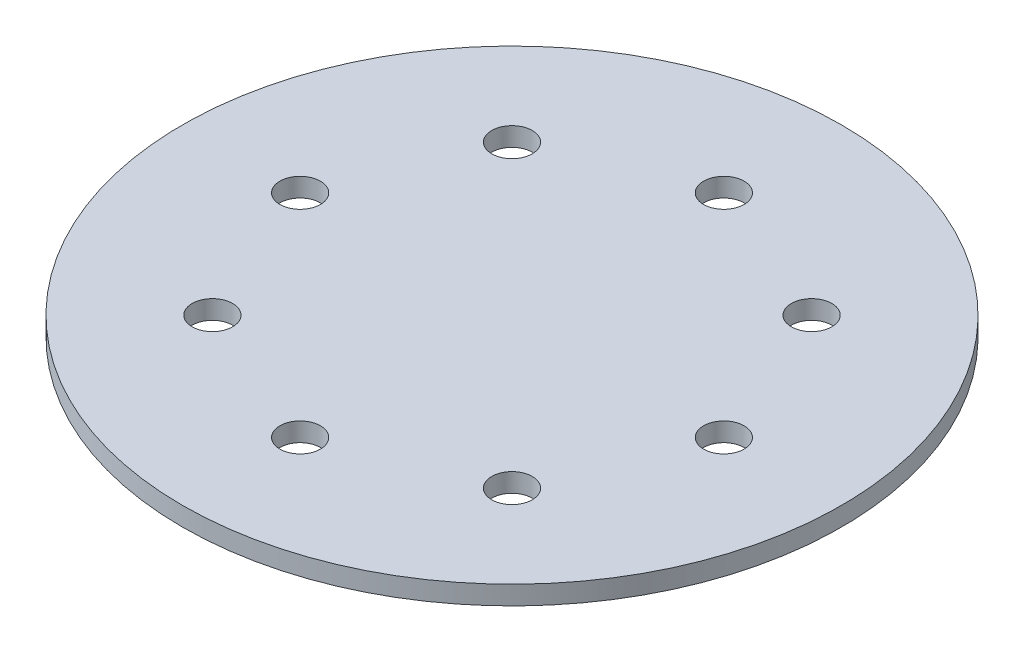
ISO-10303-21;
HEADER;
FILE_DESCRIPTION(('STEP AP214'),'2;1');
FILE_NAME('part.step','',(''),(''),'','','');
FILE_SCHEMA(('AUTOMOTIVE_DESIGN { 1 0 10303 214 1 1 1 1 }'));
ENDSEC;
DATA;
#1=APPLICATION_CONTEXT('core data for automotive mechanical design processes');
#2=APPLICATION_PROTOCOL_DEFINITION('international standard','automotive_design',2000,#1);
#3=PRODUCT_CONTEXT('',#1,'mechanical');
#4=PRODUCT('Part','Part','',(#3));
#5=PRODUCT_RELATED_PRODUCT_CATEGORY('part','',(#4));
#6=PRODUCT_DEFINITION_FORMATION('','',#4);
#7=PRODUCT_DEFINITION_CONTEXT('part definition',#1,'design');
#8=PRODUCT_DEFINITION('design','',#6,#7);
#9=PRODUCT_DEFINITION_SHAPE('','',#8);
#10=(LENGTH_UNIT() NAMED_UNIT(*) SI_UNIT(.MILLI.,.METRE.));
#11=(NAMED_UNIT(*) PLANE_ANGLE_UNIT() SI_UNIT($,.RADIAN.));
#12=(NAMED_UNIT(*) SI_UNIT($,.STERADIAN.) SOLID_ANGLE_UNIT());
#13=UNCERTAINTY_MEASURE_WITH_UNIT(LENGTH_MEASURE(1.E-05),#10,'distance_accuracy_value','');
#14=(GEOMETRIC_REPRESENTATION_CONTEXT(3) GLOBAL_UNCERTAINTY_ASSIGNED_CONTEXT((#13)) GLOBAL_UNIT_ASSIGNED_CONTEXT((#10,
#11,#12)) REPRESENTATION_CONTEXT('',''));
#15=CARTESIAN_POINT('',(0.,0.,0.));
#16=DIRECTION('',(0.,0.,1.));
#17=DIRECTION('',(1.,0.,0.));
#18=AXIS2_PLACEMENT_3D('',#15,#16,#17);
#19=CARTESIAN_POINT('',(0.,2.,0.));
#20=DIRECTION('',(0.,-1.,0.));
#21=DIRECTION('',(0.,0.,-1.));
#22=AXIS2_PLACEMENT_3D('',#19,#20,#21);
#23=CYLINDRICAL_SURFACE('',#22,35.);
#24=CARTESIAN_POINT('',(0.,2.,0.));
#25=DIRECTION('',(0.,1.,0.));
#26=DIRECTION('',(0.,0.,1.));
#27=AXIS2_PLACEMENT_3D('',#24,#25,#26);
#28=CIRCLE('',#27,35.);
#29=CARTESIAN_POINT('',(0.,2.,35.));
#30=VERTEX_POINT('',#29);
#31=EDGE_CURVE('E10',#30,#30,#28,.T.);
#32=ORIENTED_EDGE('',*,*,#31,.F.);
#33=EDGE_LOOP('',(#32));
#34=FACE_BOUND('',#33,.T.);
#35=CARTESIAN_POINT('',(0.,0.,0.));
#36=DIRECTION('',(0.,1.,0.));
#37=DIRECTION('',(0.,0.,1.));
#38=AXIS2_PLACEMENT_3D('',#35,#36,#37);
#39=CIRCLE('',#38,35.);
#40=CARTESIAN_POINT('',(0.,0.,35.));
#41=VERTEX_POINT('',#40);
#42=EDGE_CURVE('E40',#41,#41,#39,.T.);
#43=ORIENTED_EDGE('',*,*,#42,.T.);
#44=EDGE_LOOP('',(#43));
#45=FACE_BOUND('',#44,.T.);
#46=ADVANCED_FACE('F37',(#34,#45),#23,.T.);
#47=CARTESIAN_POINT('',(0.,2.,0.));
#48=DIRECTION('',(0.,1.,0.));
#49=DIRECTION('',(0.,0.,1.));
#50=AXIS2_PLACEMENT_3D('',#47,#48,#49);
#51=PLANE('',#50);
#52=CARTESIAN_POINT('',(-22.5,2.,0.));
#53=DIRECTION('',(0.,1.,0.));
#54=DIRECTION('',(1.,0.,0.));
#55=AXIS2_PLACEMENT_3D('',#52,#53,#54);
#56=CIRCLE('',#55,2.15);
#57=CARTESIAN_POINT('',(-20.35,2.,0.));
#58=VERTEX_POINT('',#57);
#59=EDGE_CURVE('E92',#58,#58,#56,.T.);
#60=ORIENTED_EDGE('',*,*,#59,.F.);
#61=EDGE_LOOP('',(#60));
#62=FACE_BOUND('',#61,.T.);
#63=CARTESIAN_POINT('',(-15.9099025766972,2.,15.9099025766974));
#64=DIRECTION('',(0.,1.,0.));
#65=DIRECTION('',(0.707106781186544,0.,-0.707106781186551));
#66=AXIS2_PLACEMENT_3D('',#63,#64,#65);
#67=CIRCLE('',#66,2.15);
#68=CARTESIAN_POINT('',(-14.3896229971462,2.,14.3896229971463));
#69=VERTEX_POINT('',#68);
#70=EDGE_CURVE('E84',#69,#69,#67,.T.);
#71=ORIENTED_EDGE('',*,*,#70,.F.);
#72=EDGE_LOOP('',(#71));
#73=FACE_BOUND('',#72,.T.);
#74=CARTESIAN_POINT('',(0.,2.,22.5));
#75=DIRECTION('',(0.,1.,0.));
#76=DIRECTION('',(0.,0.,-1.));
#77=AXIS2_PLACEMENT_3D('',#74,#75,#76);
#78=CIRCLE('',#77,2.15);
#79=CARTESIAN_POINT('',(0.,2.,20.35));
#80=VERTEX_POINT('',#79);
#81=EDGE_CURVE('E76',#80,#80,#78,.T.);
#82=ORIENTED_EDGE('',*,*,#81,.F.);
#83=EDGE_LOOP('',(#82));
#84=FACE_BOUND('',#83,.T.);
#85=CARTESIAN_POINT('',(15.9099025766975,2.,15.9099025766972));
#86=DIRECTION('',(0.,1.,0.));
#87=DIRECTION('',(-0.707106781186554,0.,-0.707106781186541));
#88=AXIS2_PLACEMENT_3D('',#85,#86,#87);
#89=CIRCLE('',#88,2.15);
#90=CARTESIAN_POINT('',(14.3896229971464,2.,14.3896229971461));
#91=VERTEX_POINT('',#90);
#92=EDGE_CURVE('E67',#91,#91,#89,.T.);
#93=ORIENTED_EDGE('',*,*,#92,.F.);
#94=EDGE_LOOP('',(#93));
#95=FACE_BOUND('',#94,.T.);
#96=CARTESIAN_POINT('',(22.5,2.,-2.35674990371912E-13));
#97=DIRECTION('',(0.,1.,0.));
#98=DIRECTION('',(-1.,0.,0.));
#99=AXIS2_PLACEMENT_3D('',#96,#97,#98);
#100=CIRCLE('',#99,2.15);
#101=CARTESIAN_POINT('',(20.35,2.,-2.13154935736373E-13));
#102=VERTEX_POINT('',#101);
#103=EDGE_CURVE('E107',#102,#102,#100,.T.);
#104=ORIENTED_EDGE('',*,*,#103,.F.);
#105=EDGE_LOOP('',(#104));
#106=FACE_BOUND('',#105,.T.);
#107=CARTESIAN_POINT('',(15.9099025766971,2.,-15.9099025766975));
#108=DIRECTION('',(0.,1.,0.));
#109=DIRECTION('',(-0.707106781186539,0.,0.707106781186556));
#110=AXIS2_PLACEMENT_3D('',#107,#108,#109);
#111=CIRCLE('',#110,2.15);
#112=CARTESIAN_POINT('',(14.3896229971461,2.,-14.3896229971464));
#113=VERTEX_POINT('',#112);
#114=EDGE_CURVE('E99',#113,#113,#111,.T.);
#115=ORIENTED_EDGE('',*,*,#114,.F.);
#116=EDGE_LOOP('',(#115));
#117=FACE_BOUND('',#116,.T.);
#118=CARTESIAN_POINT('',(-15.9099025766973,2.,-15.9099025766973));
#119=DIRECTION('',(0.,1.,0.));
#120=DIRECTION('',(0.707106781186549,0.,0.707106781186546));
#121=AXIS2_PLACEMENT_3D('',#118,#119,#120);
#122=CIRCLE('',#121,2.15);
#123=CARTESIAN_POINT('',(-14.3896229971463,2.,-14.3896229971462));
#124=VERTEX_POINT('',#123);
#125=EDGE_CURVE('E59',#124,#124,#122,.T.);
#126=ORIENTED_EDGE('',*,*,#125,.F.);
#127=EDGE_LOOP('',(#126));
#128=FACE_BOUND('',#127,.T.);
#129=CARTESIAN_POINT('',(0.,2.,-22.5));
#130=DIRECTION('',(0.,1.,0.));
#131=DIRECTION('',(0.,0.,1.));
#132=AXIS2_PLACEMENT_3D('',#129,#130,#131);
#133=CIRCLE('',#132,2.15);
#134=CARTESIAN_POINT('',(0.,2.,-20.35));
#135=VERTEX_POINT('',#134);
#136=EDGE_CURVE('E51',#135,#135,#133,.T.);
#137=ORIENTED_EDGE('',*,*,#136,.F.);
#138=EDGE_LOOP('',(#137));
#139=FACE_BOUND('',#138,.T.);
#140=ORIENTED_EDGE('',*,*,#31,.T.);
#141=EDGE_LOOP('',(#140));
#142=FACE_BOUND('',#141,.T.);
#143=ADVANCED_FACE('F126',(#62,#73,#84,#95,#106,#117,#128,#139,#142),#51,.T.);
#144=CARTESIAN_POINT('',(0.,0.,0.));
#145=DIRECTION('',(0.,1.,0.));
#146=DIRECTION('',(0.,0.,1.));
#147=AXIS2_PLACEMENT_3D('',#144,#145,#146);
#148=PLANE('',#147);
#149=CARTESIAN_POINT('',(-22.5,0.,0.));
#150=DIRECTION('',(0.,1.,0.));
#151=DIRECTION('',(1.,0.,0.));
#152=AXIS2_PLACEMENT_3D('',#149,#150,#151);
#153=CIRCLE('',#152,2.15);
#154=CARTESIAN_POINT('',(-20.35,0.,0.));
#155=VERTEX_POINT('',#154);
#156=EDGE_CURVE('E63',#155,#155,#153,.T.);
#157=ORIENTED_EDGE('',*,*,#156,.T.);
#158=EDGE_LOOP('',(#157));
#159=FACE_BOUND('',#158,.T.);
#160=CARTESIAN_POINT('',(-15.9099025766972,0.,15.9099025766974));
#161=DIRECTION('',(0.,1.,0.));
#162=DIRECTION('',(0.707106781186544,0.,-0.707106781186551));
#163=AXIS2_PLACEMENT_3D('',#160,#161,#162);
#164=CIRCLE('',#163,2.15);
#165=CARTESIAN_POINT('',(-14.3896229971462,0.,14.3896229971463));
#166=VERTEX_POINT('',#165);
#167=EDGE_CURVE('E88',#166,#166,#164,.T.);
#168=ORIENTED_EDGE('',*,*,#167,.T.);
#169=EDGE_LOOP('',(#168));
#170=FACE_BOUND('',#169,.T.);
#171=CARTESIAN_POINT('',(0.,0.,22.5));
#172=DIRECTION('',(0.,1.,0.));
#173=DIRECTION('',(0.,0.,-1.));
#174=AXIS2_PLACEMENT_3D('',#171,#172,#173);
#175=CIRCLE('',#174,2.15);
#176=CARTESIAN_POINT('',(0.,0.,20.35));
#177=VERTEX_POINT('',#176);
#178=EDGE_CURVE('E80',#177,#177,#175,.T.);
#179=ORIENTED_EDGE('',*,*,#178,.T.);
#180=EDGE_LOOP('',(#179));
#181=FACE_BOUND('',#180,.T.);
#182=CARTESIAN_POINT('',(15.9099025766975,0.,15.9099025766972));
#183=DIRECTION('',(0.,1.,0.));
#184=DIRECTION('',(-0.707106781186554,0.,-0.707106781186541));
#185=AXIS2_PLACEMENT_3D('',#182,#183,#184);
#186=CIRCLE('',#185,2.15);
#187=CARTESIAN_POINT('',(14.3896229971464,0.,14.3896229971461));
#188=VERTEX_POINT('',#187);
#189=EDGE_CURVE('E71',#188,#188,#186,.T.);
#190=ORIENTED_EDGE('',*,*,#189,.T.);
#191=EDGE_LOOP('',(#190));
#192=FACE_BOUND('',#191,.T.);
#193=CARTESIAN_POINT('',(22.5,0.,-2.35674990371912E-13));
#194=DIRECTION('',(0.,1.,0.));
#195=DIRECTION('',(-1.,0.,0.));
#196=AXIS2_PLACEMENT_3D('',#193,#194,#195);
#197=CIRCLE('',#196,2.15);
#198=CARTESIAN_POINT('',(20.35,0.,-2.13154935736373E-13));
#199=VERTEX_POINT('',#198);
#200=EDGE_CURVE('E72',#199,#199,#197,.T.);
#201=ORIENTED_EDGE('',*,*,#200,.T.);
#202=EDGE_LOOP('',(#201));
#203=FACE_BOUND('',#202,.T.);
#204=CARTESIAN_POINT('',(15.9099025766971,0.,-15.9099025766975));
#205=DIRECTION('',(0.,1.,0.));
#206=DIRECTION('',(-0.707106781186539,0.,0.707106781186556));
#207=AXIS2_PLACEMENT_3D('',#204,#205,#206);
#208=CIRCLE('',#207,2.15);
#209=CARTESIAN_POINT('',(14.3896229971461,0.,-14.3896229971464));
#210=VERTEX_POINT('',#209);
#211=EDGE_CURVE('E103',#210,#210,#208,.T.);
#212=ORIENTED_EDGE('',*,*,#211,.T.);
#213=EDGE_LOOP('',(#212));
#214=FACE_BOUND('',#213,.T.);
#215=CARTESIAN_POINT('',(-15.9099025766973,0.,-15.9099025766973));
#216=DIRECTION('',(0.,1.,0.));
#217=DIRECTION('',(0.707106781186549,0.,0.707106781186546));
#218=AXIS2_PLACEMENT_3D('',#215,#216,#217);
#219=CIRCLE('',#218,2.15);
#220=CARTESIAN_POINT('',(-14.3896229971463,0.,-14.3896229971462));
#221=VERTEX_POINT('',#220);
#222=EDGE_CURVE('E55',#221,#221,#219,.T.);
#223=ORIENTED_EDGE('',*,*,#222,.T.);
#224=EDGE_LOOP('',(#223));
#225=FACE_BOUND('',#224,.T.);
#226=CARTESIAN_POINT('',(0.,0.,-22.5));
#227=DIRECTION('',(0.,1.,0.));
#228=DIRECTION('',(0.,0.,1.));
#229=AXIS2_PLACEMENT_3D('',#226,#227,#228);
#230=CIRCLE('',#229,2.15);
#231=CARTESIAN_POINT('',(0.,0.,-20.35));
#232=VERTEX_POINT('',#231);
#233=EDGE_CURVE('E49',#232,#232,#230,.T.);
#234=ORIENTED_EDGE('',*,*,#233,.T.);
#235=EDGE_LOOP('',(#234));
#236=FACE_BOUND('',#235,.T.);
#237=ORIENTED_EDGE('',*,*,#42,.F.);
#238=EDGE_LOOP('',(#237));
#239=FACE_BOUND('',#238,.T.);
#240=ADVANCED_FACE('F115',(#159,#170,#181,#192,#203,#214,#225,#236,#239),#148,.F.);
#241=CARTESIAN_POINT('',(0.,0.,-22.5));
#242=DIRECTION('',(0.,1.,0.));
#243=DIRECTION('',(0.,0.,1.));
#244=AXIS2_PLACEMENT_3D('',#241,#242,#243);
#245=CYLINDRICAL_SURFACE('',#244,2.15);
#246=ORIENTED_EDGE('',*,*,#233,.F.);
#247=EDGE_LOOP('',(#246));
#248=FACE_BOUND('',#247,.T.);
#249=ORIENTED_EDGE('',*,*,#136,.T.);
#250=EDGE_LOOP('',(#249));
#251=FACE_BOUND('',#250,.T.);
#252=ADVANCED_FACE('F137',(#248,#251),#245,.F.);
#253=CARTESIAN_POINT('',(-15.9099025766973,0.,-15.9099025766973));
#254=DIRECTION('',(0.,1.,0.));
#255=DIRECTION('',(0.,0.,1.));
#256=AXIS2_PLACEMENT_3D('',#253,#254,#255);
#257=CYLINDRICAL_SURFACE('',#256,2.15);
#258=ORIENTED_EDGE('',*,*,#222,.F.);
#259=EDGE_LOOP('',(#258));
#260=FACE_BOUND('',#259,.T.);
#261=ORIENTED_EDGE('',*,*,#125,.T.);
#262=EDGE_LOOP('',(#261));
#263=FACE_BOUND('',#262,.T.);
#264=ADVANCED_FACE('F139',(#260,#263),#257,.F.);
#265=CARTESIAN_POINT('',(15.9099025766971,0.,-15.9099025766975));
#266=DIRECTION('',(0.,1.,0.));
#267=DIRECTION('',(0.,0.,1.));
#268=AXIS2_PLACEMENT_3D('',#265,#266,#267);
#269=CYLINDRICAL_SURFACE('',#268,2.15);
#270=ORIENTED_EDGE('',*,*,#211,.F.);
#271=EDGE_LOOP('',(#270));
#272=FACE_BOUND('',#271,.T.);
#273=ORIENTED_EDGE('',*,*,#114,.T.);
#274=EDGE_LOOP('',(#273));
#275=FACE_BOUND('',#274,.T.);
#276=ADVANCED_FACE('F122',(#272,#275),#269,.F.);
#277=CARTESIAN_POINT('',(22.5,0.,-2.35674990371912E-13));
#278=DIRECTION('',(0.,1.,0.));
#279=DIRECTION('',(0.,0.,1.));
#280=AXIS2_PLACEMENT_3D('',#277,#278,#279);
#281=CYLINDRICAL_SURFACE('',#280,2.15);
#282=ORIENTED_EDGE('',*,*,#200,.F.);
#283=EDGE_LOOP('',(#282));
#284=FACE_BOUND('',#283,.T.);
#285=ORIENTED_EDGE('',*,*,#103,.T.);
#286=EDGE_LOOP('',(#285));
#287=FACE_BOUND('',#286,.T.);
#288=ADVANCED_FACE('F118',(#284,#287),#281,.F.);
#289=CARTESIAN_POINT('',(15.9099025766975,0.,15.9099025766972));
#290=DIRECTION('',(0.,1.,0.));
#291=DIRECTION('',(0.,0.,1.));
#292=AXIS2_PLACEMENT_3D('',#289,#290,#291);
#293=CYLINDRICAL_SURFACE('',#292,2.15);
#294=ORIENTED_EDGE('',*,*,#189,.F.);
#295=EDGE_LOOP('',(#294));
#296=FACE_BOUND('',#295,.T.);
#297=ORIENTED_EDGE('',*,*,#92,.T.);
#298=EDGE_LOOP('',(#297));
#299=FACE_BOUND('',#298,.T.);
#300=ADVANCED_FACE('F121',(#296,#299),#293,.F.);
#301=CARTESIAN_POINT('',(0.,0.,22.5));
#302=DIRECTION('',(0.,1.,0.));
#303=DIRECTION('',(0.,0.,1.));
#304=AXIS2_PLACEMENT_3D('',#301,#302,#303);
#305=CYLINDRICAL_SURFACE('',#304,2.15);
#306=ORIENTED_EDGE('',*,*,#178,.F.);
#307=EDGE_LOOP('',(#306));
#308=FACE_BOUND('',#307,.T.);
#309=ORIENTED_EDGE('',*,*,#81,.T.);
#310=EDGE_LOOP('',(#309));
#311=FACE_BOUND('',#310,.T.);
#312=ADVANCED_FACE('F196',(#308,#311),#305,.F.);
#313=CARTESIAN_POINT('',(-15.9099025766972,0.,15.9099025766974));
#314=DIRECTION('',(0.,1.,0.));
#315=DIRECTION('',(0.,0.,1.));
#316=AXIS2_PLACEMENT_3D('',#313,#314,#315);
#317=CYLINDRICAL_SURFACE('',#316,2.15);
#318=ORIENTED_EDGE('',*,*,#167,.F.);
#319=EDGE_LOOP('',(#318));
#320=FACE_BOUND('',#319,.T.);
#321=ORIENTED_EDGE('',*,*,#70,.T.);
#322=EDGE_LOOP('',(#321));
#323=FACE_BOUND('',#322,.T.);
#324=ADVANCED_FACE('F206',(#320,#323),#317,.F.);
#325=CARTESIAN_POINT('',(-22.5,0.,0.));
#326=DIRECTION('',(0.,1.,0.));
#327=DIRECTION('',(0.,0.,1.));
#328=AXIS2_PLACEMENT_3D('',#325,#326,#327);
#329=CYLINDRICAL_SURFACE('',#328,2.15);
#330=ORIENTED_EDGE('',*,*,#156,.F.);
#331=EDGE_LOOP('',(#330));
#332=FACE_BOUND('',#331,.T.);
#333=ORIENTED_EDGE('',*,*,#59,.T.);
#334=EDGE_LOOP('',(#333));
#335=FACE_BOUND('',#334,.T.);
#336=ADVANCED_FACE('F216',(#332,#335),#329,.F.);
#337=CLOSED_SHELL('',(#46,#143,#240,#252,#264,#276,#288,#300,#312,#324,#336));
#338=MANIFOLD_SOLID_BREP('B2',#337);
#339=ADVANCED_BREP_SHAPE_REPRESENTATION('',(#18,#338),#14);
#340=SHAPE_DEFINITION_REPRESENTATION(#9,#339);
ENDSEC;
END-ISO-10303-21;
